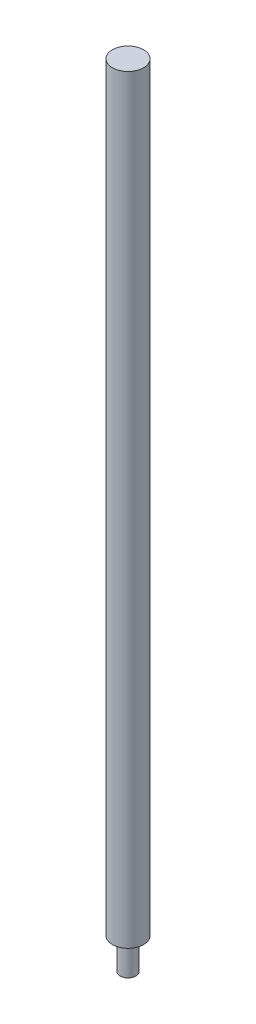
ISO-10303-21;
HEADER;
FILE_DESCRIPTION(('STEP AP214'),'2;1');
FILE_NAME('part.step','',(''),(''),'','','');
FILE_SCHEMA(('AUTOMOTIVE_DESIGN { 1 0 10303 214 1 1 1 1 }'));
ENDSEC;
DATA;
#1=APPLICATION_CONTEXT('core data for automotive mechanical design processes');
#2=APPLICATION_PROTOCOL_DEFINITION('international standard','automotive_design',2000,#1);
#3=PRODUCT_CONTEXT('',#1,'mechanical');
#4=PRODUCT('Part','Part','',(#3));
#5=PRODUCT_RELATED_PRODUCT_CATEGORY('part','',(#4));
#6=PRODUCT_DEFINITION_FORMATION('','',#4);
#7=PRODUCT_DEFINITION_CONTEXT('part definition',#1,'design');
#8=PRODUCT_DEFINITION('design','',#6,#7);
#9=PRODUCT_DEFINITION_SHAPE('','',#8);
#10=(LENGTH_UNIT() NAMED_UNIT(*) SI_UNIT(.MILLI.,.METRE.));
#11=(NAMED_UNIT(*) PLANE_ANGLE_UNIT() SI_UNIT($,.RADIAN.));
#12=(NAMED_UNIT(*) SI_UNIT($,.STERADIAN.) SOLID_ANGLE_UNIT());
#13=UNCERTAINTY_MEASURE_WITH_UNIT(LENGTH_MEASURE(1.E-05),#10,'distance_accuracy_value','');
#14=(GEOMETRIC_REPRESENTATION_CONTEXT(3) GLOBAL_UNCERTAINTY_ASSIGNED_CONTEXT((#13)) GLOBAL_UNIT_ASSIGNED_CONTEXT((#10,
#11,#12)) REPRESENTATION_CONTEXT('',''));
#15=CARTESIAN_POINT('',(0.,0.,0.));
#16=DIRECTION('',(0.,0.,1.));
#17=DIRECTION('',(1.,0.,0.));
#18=AXIS2_PLACEMENT_3D('',#15,#16,#17);
#19=CARTESIAN_POINT('',(0.,241.3,0.));
#20=DIRECTION('',(0.,-1.,0.));
#21=DIRECTION('',(0.,0.,-1.));
#22=AXIS2_PLACEMENT_3D('',#19,#20,#21);
#23=CYLINDRICAL_SURFACE('',#22,4.7625);
#24=CARTESIAN_POINT('',(0.,241.3,0.));
#25=DIRECTION('',(0.,1.,0.));
#26=DIRECTION('',(0.,0.,1.));
#27=AXIS2_PLACEMENT_3D('',#24,#25,#26);
#28=CIRCLE('',#27,4.7625);
#29=CARTESIAN_POINT('',(0.,241.3,-4.7625));
#30=VERTEX_POINT('',#29);
#31=EDGE_CURVE('E10',#30,#30,#28,.T.);
#32=CARTESIAN_POINT('',(0.,9.525,0.));
#33=DIRECTION('',(0.,-1.,0.));
#34=DIRECTION('',(0.,0.,-1.));
#35=AXIS2_PLACEMENT_3D('',#32,#33,#34);
#36=CIRCLE('',#35,4.7625);
#37=CARTESIAN_POINT('',(0.,9.52500000000001,-4.7625));
#38=VERTEX_POINT('',#37);
#39=EDGE_CURVE('E37',#38,#38,#36,.T.);
#40=CARTESIAN_POINT('',(0.,241.3,-4.7625));
#41=CARTESIAN_POINT('',(0.,238.885677083333,-4.7625));
#42=CARTESIAN_POINT('',(0.,236.471354166667,-4.7625));
#43=CARTESIAN_POINT('',(0.,231.642708333333,-4.7625));
#44=CARTESIAN_POINT('',(0.,229.228385416667,-4.7625));
#45=CARTESIAN_POINT('',(0.,224.399739583333,-4.7625));
#46=CARTESIAN_POINT('',(0.,221.985416666667,-4.7625));
#47=CARTESIAN_POINT('',(0.,217.156770833333,-4.7625));
#48=CARTESIAN_POINT('',(0.,214.742447916667,-4.7625));
#49=CARTESIAN_POINT('',(0.,209.913802083333,-4.7625));
#50=CARTESIAN_POINT('',(0.,207.499479166667,-4.7625));
#51=CARTESIAN_POINT('',(0.,202.670833333333,-4.7625));
#52=CARTESIAN_POINT('',(0.,200.256510416667,-4.7625));
#53=CARTESIAN_POINT('',(0.,195.427864583333,-4.7625));
#54=CARTESIAN_POINT('',(0.,193.013541666667,-4.7625));
#55=CARTESIAN_POINT('',(0.,188.184895833333,-4.7625));
#56=CARTESIAN_POINT('',(0.,185.770572916667,-4.7625));
#57=CARTESIAN_POINT('',(0.,180.941927083333,-4.7625));
#58=CARTESIAN_POINT('',(0.,178.527604166667,-4.7625));
#59=CARTESIAN_POINT('',(0.,173.698958333333,-4.7625));
#60=CARTESIAN_POINT('',(0.,171.284635416667,-4.7625));
#61=CARTESIAN_POINT('',(0.,166.455989583333,-4.7625));
#62=CARTESIAN_POINT('',(0.,164.041666666667,-4.7625));
#63=CARTESIAN_POINT('',(0.,159.213020833333,-4.7625));
#64=CARTESIAN_POINT('',(0.,156.798697916667,-4.7625));
#65=CARTESIAN_POINT('',(0.,151.970052083333,-4.7625));
#66=CARTESIAN_POINT('',(0.,149.555729166667,-4.7625));
#67=CARTESIAN_POINT('',(0.,144.727083333333,-4.7625));
#68=CARTESIAN_POINT('',(0.,142.312760416667,-4.7625));
#69=CARTESIAN_POINT('',(0.,137.484114583333,-4.7625));
#70=CARTESIAN_POINT('',(0.,135.069791666667,-4.7625));
#71=CARTESIAN_POINT('',(0.,130.241145833333,-4.7625));
#72=CARTESIAN_POINT('',(0.,127.826822916667,-4.7625));
#73=CARTESIAN_POINT('',(0.,122.998177083333,-4.7625));
#74=CARTESIAN_POINT('',(0.,120.583854166667,-4.7625));
#75=CARTESIAN_POINT('',(0.,115.755208333333,-4.7625));
#76=CARTESIAN_POINT('',(0.,113.340885416667,-4.7625));
#77=CARTESIAN_POINT('',(0.,108.512239583333,-4.7625));
#78=CARTESIAN_POINT('',(0.,106.097916666667,-4.7625));
#79=CARTESIAN_POINT('',(0.,101.269270833333,-4.7625));
#80=CARTESIAN_POINT('',(0.,98.8549479166667,-4.7625));
#81=CARTESIAN_POINT('',(0.,94.0263020833333,-4.7625));
#82=CARTESIAN_POINT('',(0.,91.6119791666667,-4.7625));
#83=CARTESIAN_POINT('',(0.,86.7833333333333,-4.7625));
#84=CARTESIAN_POINT('',(0.,84.3690104166667,-4.7625));
#85=CARTESIAN_POINT('',(0.,79.5403645833333,-4.7625));
#86=CARTESIAN_POINT('',(0.,77.1260416666667,-4.7625));
#87=CARTESIAN_POINT('',(0.,72.2973958333333,-4.7625));
#88=CARTESIAN_POINT('',(0.,69.8830729166667,-4.7625));
#89=CARTESIAN_POINT('',(0.,65.0544270833333,-4.7625));
#90=CARTESIAN_POINT('',(0.,62.6401041666667,-4.7625));
#91=CARTESIAN_POINT('',(0.,57.8114583333333,-4.7625));
#92=CARTESIAN_POINT('',(0.,55.3971354166667,-4.7625));
#93=CARTESIAN_POINT('',(0.,50.5684895833333,-4.7625));
#94=CARTESIAN_POINT('',(0.,48.1541666666667,-4.7625));
#95=CARTESIAN_POINT('',(0.,43.3255208333333,-4.7625));
#96=CARTESIAN_POINT('',(0.,40.9111979166667,-4.7625));
#97=CARTESIAN_POINT('',(0.,36.0825520833333,-4.7625));
#98=CARTESIAN_POINT('',(0.,33.6682291666667,-4.7625));
#99=CARTESIAN_POINT('',(0.,28.8395833333333,-4.7625));
#100=CARTESIAN_POINT('',(0.,26.4252604166667,-4.7625));
#101=CARTESIAN_POINT('',(0.,21.5966145833333,-4.7625));
#102=CARTESIAN_POINT('',(0.,19.1822916666667,-4.7625));
#103=CARTESIAN_POINT('',(0.,14.3536458333333,-4.7625));
#104=CARTESIAN_POINT('',(0.,11.9393229166667,-4.7625));
#105=CARTESIAN_POINT('',(0.,9.52500000000001,-4.7625));
#106=B_SPLINE_CURVE_WITH_KNOTS('',3,(#40,#41,#42,#43,#44,#45,#46,#47,#48,#49,#50,#51,#52,#53,
#54,#55,#56,#57,#58,#59,#60,#61,#62,#63,#64,#65,#66,#67,#68,#69,#70,#71,#72,#73,#74,#75,#76,#77,
#78,#79,#80,#81,#82,#83,#84,#85,#86,#87,#88,#89,#90,#91,#92,#93,#94,#95,#96,#97,#98,#99,#100,
#101,#102,#103,#104,#105),.UNSPECIFIED.,.F.,.F.,(4,2,2,2,2,2,2,2,2,2,2,2,2,2,2,2,2,2,2,2,2,2,2,
2,2,2,2,2,2,2,2,2,4),(0.,7.24296874999999,14.4859375,21.72890625,28.971875,36.21484375,
43.4578125,50.70078125,57.94375,65.18671875,72.4296875,79.67265625,86.915625,94.15859375,
101.4015625,108.64453125,115.8875,123.13046875,130.3734375,137.61640625,144.859375,152.10234375,
159.3453125,166.58828125,173.83125,181.07421875,188.3171875,195.56015625,202.803125,
210.04609375,217.2890625,224.53203125,231.775),.UNSPECIFIED.);
#107=EDGE_CURVE('BSEAM31',#30,#38,#106,.T.);
#108=ORIENTED_EDGE('',*,*,#31,.F.);
#109=ORIENTED_EDGE('',*,*,#39,.F.);
#110=ORIENTED_EDGE('',*,*,#107,.T.);
#111=ORIENTED_EDGE('',*,*,#107,.F.);
#112=EDGE_LOOP('',(#108,#110,#109,#111));
#113=FACE_BOUND('',#112,.T.);
#114=ADVANCED_FACE('F31',(#113),#23,.T.);
#115=CARTESIAN_POINT('',(0.,241.3,0.));
#116=DIRECTION('',(0.,1.,0.));
#117=DIRECTION('',(0.,0.,1.));
#118=AXIS2_PLACEMENT_3D('',#115,#116,#117);
#119=PLANE('',#118);
#120=ORIENTED_EDGE('',*,*,#31,.T.);
#121=EDGE_LOOP('',(#120));
#122=FACE_BOUND('',#121,.T.);
#123=ADVANCED_FACE('F62',(#122),#119,.T.);
#124=CARTESIAN_POINT('',(0.,9.525,0.));
#125=DIRECTION('',(0.,-1.,0.));
#126=DIRECTION('',(0.,0.,-1.));
#127=AXIS2_PLACEMENT_3D('',#124,#125,#126);
#128=PLANE('',#127);
#129=CARTESIAN_POINT('',(0.,9.525,0.));
#130=DIRECTION('',(0.,-1.,0.));
#131=DIRECTION('',(0.,0.,-1.));
#132=AXIS2_PLACEMENT_3D('',#129,#130,#131);
#133=CIRCLE('',#132,2.38125);
#134=CARTESIAN_POINT('',(0.,9.525,-2.38125));
#135=VERTEX_POINT('',#134);
#136=EDGE_CURVE('E41',#135,#135,#133,.T.);
#137=ORIENTED_EDGE('',*,*,#136,.F.);
#138=EDGE_LOOP('',(#137));
#139=FACE_BOUND('',#138,.T.);
#140=ORIENTED_EDGE('',*,*,#39,.T.);
#141=EDGE_LOOP('',(#140));
#142=FACE_BOUND('',#141,.T.);
#143=ADVANCED_FACE('F55',(#139,#142),#128,.T.);
#144=CARTESIAN_POINT('',(0.,9.525,0.));
#145=DIRECTION('',(0.,-1.,0.));
#146=DIRECTION('',(0.,0.,-1.));
#147=AXIS2_PLACEMENT_3D('',#144,#145,#146);
#148=CYLINDRICAL_SURFACE('',#147,2.38125);
#149=CARTESIAN_POINT('',(0.,0.,0.));
#150=DIRECTION('',(0.,-1.,0.));
#151=DIRECTION('',(0.,0.,-1.));
#152=AXIS2_PLACEMENT_3D('',#149,#150,#151);
#153=CIRCLE('',#152,2.38125);
#154=CARTESIAN_POINT('',(0.,0.,-2.38125));
#155=VERTEX_POINT('',#154);
#156=EDGE_CURVE('E45',#155,#155,#153,.T.);
#157=CARTESIAN_POINT('',(0.,9.525,-2.38125));
#158=CARTESIAN_POINT('',(0.,9.42578125,-2.38125));
#159=CARTESIAN_POINT('',(0.,9.3265625,-2.38125));
#160=CARTESIAN_POINT('',(0.,9.128125,-2.38125));
#161=CARTESIAN_POINT('',(0.,9.02890625,-2.38125));
#162=CARTESIAN_POINT('',(0.,8.83046875,-2.38125));
#163=CARTESIAN_POINT('',(0.,8.73125,-2.38125));
#164=CARTESIAN_POINT('',(0.,8.5328125,-2.38125));
#165=CARTESIAN_POINT('',(0.,8.43359375,-2.38125));
#166=CARTESIAN_POINT('',(0.,8.23515625,-2.38125));
#167=CARTESIAN_POINT('',(0.,8.1359375,-2.38125));
#168=CARTESIAN_POINT('',(0.,7.9375,-2.38125));
#169=CARTESIAN_POINT('',(0.,7.83828125,-2.38125));
#170=CARTESIAN_POINT('',(0.,7.63984375,-2.38125));
#171=CARTESIAN_POINT('',(0.,7.540625,-2.38125));
#172=CARTESIAN_POINT('',(0.,7.3421875,-2.38125));
#173=CARTESIAN_POINT('',(0.,7.24296875,-2.38125));
#174=CARTESIAN_POINT('',(0.,7.04453125,-2.38125));
#175=CARTESIAN_POINT('',(0.,6.9453125,-2.38125));
#176=CARTESIAN_POINT('',(0.,6.746875,-2.38125));
#177=CARTESIAN_POINT('',(0.,6.64765625,-2.38125));
#178=CARTESIAN_POINT('',(0.,6.44921875,-2.38125));
#179=CARTESIAN_POINT('',(0.,6.35,-2.38125));
#180=CARTESIAN_POINT('',(0.,6.1515625,-2.38125));
#181=CARTESIAN_POINT('',(0.,6.05234375,-2.38125));
#182=CARTESIAN_POINT('',(0.,5.85390625,-2.38125));
#183=CARTESIAN_POINT('',(0.,5.7546875,-2.38125));
#184=CARTESIAN_POINT('',(0.,5.55625,-2.38125));
#185=CARTESIAN_POINT('',(0.,5.45703125,-2.38125));
#186=CARTESIAN_POINT('',(0.,5.25859375,-2.38125));
#187=CARTESIAN_POINT('',(0.,5.159375,-2.38125));
#188=CARTESIAN_POINT('',(0.,4.9609375,-2.38125));
#189=CARTESIAN_POINT('',(0.,4.86171875,-2.38125));
#190=CARTESIAN_POINT('',(0.,4.66328125,-2.38125));
#191=CARTESIAN_POINT('',(0.,4.5640625,-2.38125));
#192=CARTESIAN_POINT('',(0.,4.365625,-2.38125));
#193=CARTESIAN_POINT('',(0.,4.26640625,-2.38125));
#194=CARTESIAN_POINT('',(0.,4.06796875,-2.38125));
#195=CARTESIAN_POINT('',(0.,3.96875,-2.38125));
#196=CARTESIAN_POINT('',(0.,3.7703125,-2.38125));
#197=CARTESIAN_POINT('',(0.,3.67109375,-2.38125));
#198=CARTESIAN_POINT('',(0.,3.47265625,-2.38125));
#199=CARTESIAN_POINT('',(0.,3.3734375,-2.38125));
#200=CARTESIAN_POINT('',(0.,3.175,-2.38125));
#201=CARTESIAN_POINT('',(0.,3.07578125,-2.38125));
#202=CARTESIAN_POINT('',(0.,2.87734375,-2.38125));
#203=CARTESIAN_POINT('',(0.,2.778125,-2.38125));
#204=CARTESIAN_POINT('',(0.,2.5796875,-2.38125));
#205=CARTESIAN_POINT('',(0.,2.48046875,-2.38125));
#206=CARTESIAN_POINT('',(0.,2.28203125,-2.38125));
#207=CARTESIAN_POINT('',(0.,2.1828125,-2.38125));
#208=CARTESIAN_POINT('',(0.,1.984375,-2.38125));
#209=CARTESIAN_POINT('',(0.,1.88515625,-2.38125));
#210=CARTESIAN_POINT('',(0.,1.68671875,-2.38125));
#211=CARTESIAN_POINT('',(0.,1.5875,-2.38125));
#212=CARTESIAN_POINT('',(0.,1.3890625,-2.38125));
#213=CARTESIAN_POINT('',(0.,1.28984375,-2.38125));
#214=CARTESIAN_POINT('',(0.,1.09140625,-2.38125));
#215=CARTESIAN_POINT('',(0.,0.992187500000001,-2.38125));
#216=CARTESIAN_POINT('',(0.,0.793750000000001,-2.38125));
#217=CARTESIAN_POINT('',(0.,0.69453125,-2.38125));
#218=CARTESIAN_POINT('',(0.,0.49609375,-2.38125));
#219=CARTESIAN_POINT('',(0.,0.396875,-2.38125));
#220=CARTESIAN_POINT('',(0.,0.1984375,-2.38125));
#221=CARTESIAN_POINT('',(0.,0.0992187500000001,-2.38125));
#222=CARTESIAN_POINT('',(0.,0.,-2.38125));
#223=B_SPLINE_CURVE_WITH_KNOTS('',3,(#157,#158,#159,#160,#161,#162,#163,#164,#165,#166,#167,
#168,#169,#170,#171,#172,#173,#174,#175,#176,#177,#178,#179,#180,#181,#182,#183,#184,#185,#186,
#187,#188,#189,#190,#191,#192,#193,#194,#195,#196,#197,#198,#199,#200,#201,#202,#203,#204,#205,
#206,#207,#208,#209,#210,#211,#212,#213,#214,#215,#216,#217,#218,#219,#220,#221,#222),
.UNSPECIFIED.,.F.,.F.,(4,2,2,2,2,2,2,2,2,2,2,2,2,2,2,2,2,2,2,2,2,2,2,2,2,2,2,2,2,2,2,2,4),(0.,
0.297656249999998,0.595312499999999,0.892968749999999,1.190625,1.48828125,1.7859375,2.08359375,
2.38125,2.67890625,2.9765625,3.27421875,3.571875,3.86953125,4.1671875,4.46484375,4.7625,
5.06015625,5.3578125,5.65546875,5.953125,6.25078125,6.5484375,6.84609375,7.14375,7.44140625,
7.7390625,8.03671875,8.334375,8.63203125,8.9296875,9.22734375,9.525),.UNSPECIFIED.);
#224=EDGE_CURVE('BSEAM53',#135,#155,#223,.T.);
#225=ORIENTED_EDGE('',*,*,#136,.T.);
#226=ORIENTED_EDGE('',*,*,#156,.F.);
#227=ORIENTED_EDGE('',*,*,#224,.T.);
#228=ORIENTED_EDGE('',*,*,#224,.F.);
#229=EDGE_LOOP('',(#225,#227,#226,#228));
#230=FACE_BOUND('',#229,.T.);
#231=ADVANCED_FACE('F53',(#230),#148,.T.);
#232=CARTESIAN_POINT('',(0.,0.,0.));
#233=DIRECTION('',(0.,1.,0.));
#234=DIRECTION('',(0.,0.,1.));
#235=AXIS2_PLACEMENT_3D('',#232,#233,#234);
#236=PLANE('',#235);
#237=ORIENTED_EDGE('',*,*,#156,.T.);
#238=EDGE_LOOP('',(#237));
#239=FACE_BOUND('',#238,.T.);
#240=ADVANCED_FACE('F51',(#239),#236,.F.);
#241=CLOSED_SHELL('',(#114,#123,#143,#231,#240));
#242=MANIFOLD_SOLID_BREP('B2',#241);
#243=ADVANCED_BREP_SHAPE_REPRESENTATION('',(#18,#242),#14);
#244=SHAPE_DEFINITION_REPRESENTATION(#9,#243);
ENDSEC;
END-ISO-10303-21;
